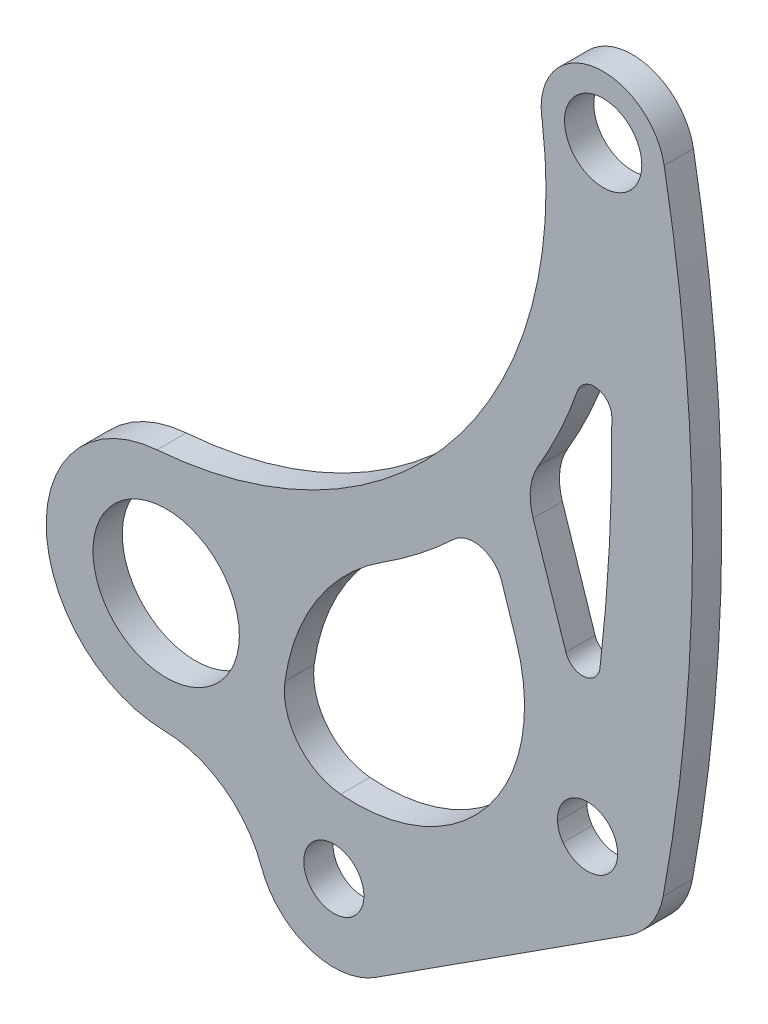
ISO-10303-21;
HEADER;
FILE_DESCRIPTION(('STEP AP214'),'2;1');
FILE_NAME('part.step','',(''),(''),'','','');
FILE_SCHEMA(('AUTOMOTIVE_DESIGN { 1 0 10303 214 1 1 1 1 }'));
ENDSEC;
DATA;
#1=APPLICATION_CONTEXT('core data for automotive mechanical design processes');
#2=APPLICATION_PROTOCOL_DEFINITION('international standard','automotive_design',2000,#1);
#3=PRODUCT_CONTEXT('',#1,'mechanical');
#4=PRODUCT('Part','Part','',(#3));
#5=PRODUCT_RELATED_PRODUCT_CATEGORY('part','',(#4));
#6=PRODUCT_DEFINITION_FORMATION('','',#4);
#7=PRODUCT_DEFINITION_CONTEXT('part definition',#1,'design');
#8=PRODUCT_DEFINITION('design','',#6,#7);
#9=PRODUCT_DEFINITION_SHAPE('','',#8);
#10=(LENGTH_UNIT() NAMED_UNIT(*) SI_UNIT(.MILLI.,.METRE.));
#11=(NAMED_UNIT(*) PLANE_ANGLE_UNIT() SI_UNIT($,.RADIAN.));
#12=(NAMED_UNIT(*) SI_UNIT($,.STERADIAN.) SOLID_ANGLE_UNIT());
#13=UNCERTAINTY_MEASURE_WITH_UNIT(LENGTH_MEASURE(1.E-05),#10,'distance_accuracy_value','');
#14=(GEOMETRIC_REPRESENTATION_CONTEXT(3) GLOBAL_UNCERTAINTY_ASSIGNED_CONTEXT((#13)) GLOBAL_UNIT_ASSIGNED_CONTEXT((#10,
#11,#12)) REPRESENTATION_CONTEXT('',''));
#15=CARTESIAN_POINT('',(0.,0.,0.));
#16=DIRECTION('',(0.,0.,1.));
#17=DIRECTION('',(1.,0.,0.));
#18=AXIS2_PLACEMENT_3D('',#15,#16,#17);
#19=CARTESIAN_POINT('',(0.,0.,3.175));
#20=DIRECTION('',(0.,0.,1.));
#21=DIRECTION('',(1.,0.,0.));
#22=AXIS2_PLACEMENT_3D('',#19,#20,#21);
#23=PLANE('',#22);
#24=CARTESIAN_POINT('',(18.1918286643398,-17.726177530627,3.175));
#25=DIRECTION('',(0.,0.,1.));
#26=DIRECTION('',(1.,0.,0.));
#27=AXIS2_PLACEMENT_3D('',#24,#25,#26);
#28=CIRCLE('',#27,3.2639);
#29=CARTESIAN_POINT('',(21.4557286643398,-17.726177530627,3.175));
#30=VERTEX_POINT('',#29);
#31=EDGE_CURVE('E348',#30,#30,#28,.T.);
#32=ORIENTED_EDGE('',*,*,#31,.F.);
#33=EDGE_LOOP('',(#32));
#34=FACE_BOUND('',#33,.T.);
#35=CARTESIAN_POINT('',(45.72,0.,3.175));
#36=DIRECTION('',(0.,0.,1.));
#37=DIRECTION('',(1.,0.,0.));
#38=AXIS2_PLACEMENT_3D('',#35,#36,#37);
#39=CIRCLE('',#38,3.2639);
#40=CARTESIAN_POINT('',(43.0519360241002,-1.88002069948861,3.175));
#41=VERTEX_POINT('',#40);
#42=CARTESIAN_POINT('',(48.9774236201806,0.205510507492002,3.175));
#43=VERTEX_POINT('',#42);
#44=EDGE_CURVE('E344',#41,#43,#39,.T.);
#45=ORIENTED_EDGE('',*,*,#44,.F.);
#46=CARTESIAN_POINT('',(42.4625763798194,-0.205510507492002,3.175));
#47=VERTEX_POINT('',#46);
#48=EDGE_CURVE('E343',#47,#41,#39,.T.);
#49=ORIENTED_EDGE('',*,*,#48,.F.);
#50=CARTESIAN_POINT('',(48.3880639758998,1.88002069948861,3.175));
#51=VERTEX_POINT('',#50);
#52=EDGE_CURVE('E350',#51,#47,#39,.T.);
#53=ORIENTED_EDGE('',*,*,#52,.F.);
#54=EDGE_CURVE('E349',#43,#51,#39,.T.);
#55=ORIENTED_EDGE('',*,*,#54,.F.);
#56=EDGE_LOOP('',(#45,#49,#53,#55));
#57=FACE_BOUND('',#56,.T.);
#58=DIRECTION('',(0.312500715155273,-0.949917524329056,0.));
#59=VECTOR('',#58,1.);
#60=CARTESIAN_POINT('',(43.9242602583384,14.4500573911322,3.175));
#61=LINE('',#60,#59);
#62=CARTESIAN_POINT('',(39.8116959434713,26.9511389028385,3.175));
#63=VERTEX_POINT('',#62);
#64=CARTESIAN_POINT('',(43.3685228303553,16.1393486348481,3.175));
#65=VERTEX_POINT('',#64);
#66=EDGE_CURVE('E340',#63,#65,#61,.T.);
#67=ORIENTED_EDGE('',*,*,#66,.F.);
#68=CARTESIAN_POINT('',(45.8436722229608,28.9355184440745,3.175));
#69=DIRECTION('',(0.,0.,1.));
#70=DIRECTION('',(1.,0.,0.));
#71=AXIS2_PLACEMENT_3D('',#68,#69,#70);
#72=CIRCLE('',#71,6.35);
#73=CARTESIAN_POINT('',(40.3709543283503,32.1560554871792,3.175));
#74=VERTEX_POINT('',#73);
#75=EDGE_CURVE('E482',#63,#74,#72,.F.);
#76=ORIENTED_EDGE('',*,*,#75,.T.);
#77=CARTESIAN_POINT('',(-4.50533240745612,58.5644592406378,3.175));
#78=DIRECTION('',(0.,0.,1.));
#79=DIRECTION('',(1.,0.,0.));
#80=AXIS2_PLACEMENT_3D('',#77,#78,#79);
#81=CIRCLE('',#80,52.07);
#82=CARTESIAN_POINT('',(44.646607754843,41.3780786361658,3.175));
#83=VERTEX_POINT('',#82);
#84=EDGE_CURVE('E329',#74,#83,#81,.T.);
#85=ORIENTED_EDGE('',*,*,#84,.T.);
#86=CARTESIAN_POINT('',(46.4448494680978,40.7493086140509,3.175));
#87=DIRECTION('',(0.,0.,1.));
#88=DIRECTION('',(1.,0.,0.));
#89=AXIS2_PLACEMENT_3D('',#86,#87,#88);
#90=CIRCLE('',#89,1.905);
#91=CARTESIAN_POINT('',(48.3497321227549,40.7704526909221,3.175));
#92=VERTEX_POINT('',#91);
#93=EDGE_CURVE('E469',#83,#92,#90,.F.);
#94=ORIENTED_EDGE('',*,*,#93,.T.);
#95=CARTESIAN_POINT('',(-142.138533342949,38.656045003802,3.175));
#96=DIRECTION('',(0.,0.,1.));
#97=DIRECTION('',(1.,0.,0.));
#98=AXIS2_PLACEMENT_3D('',#95,#96,#97);
#99=CIRCLE('',#98,190.5);
#100=CARTESIAN_POINT('',(47.0702030784157,16.5132343910918,3.175));
#101=VERTEX_POINT('',#100);
#102=EDGE_CURVE('E336',#101,#92,#99,.T.);
#103=ORIENTED_EDGE('',*,*,#102,.F.);
#104=CARTESIAN_POINT('',(45.1781157142021,16.7346624972189,3.175));
#105=DIRECTION('',(0.,0.,1.));
#106=DIRECTION('',(1.,0.,0.));
#107=AXIS2_PLACEMENT_3D('',#104,#105,#106);
#108=CIRCLE('',#107,1.905);
#109=EDGE_CURVE('E461',#101,#65,#108,.F.);
#110=ORIENTED_EDGE('',*,*,#109,.T.);
#111=EDGE_LOOP('',(#67,#76,#85,#94,#103,#110));
#112=FACE_BOUND('',#111,.T.);
#113=CARTESIAN_POINT('',(0.,0.,3.175));
#114=DIRECTION('',(0.,0.,1.));
#115=DIRECTION('',(1.,0.,0.));
#116=AXIS2_PLACEMENT_3D('',#113,#114,#115);
#117=CIRCLE('',#116,7.9375);
#118=CARTESIAN_POINT('',(7.9375,0.,3.175));
#119=VERTEX_POINT('',#118);
#120=EDGE_CURVE('E332',#119,#119,#117,.T.);
#121=ORIENTED_EDGE('',*,*,#120,.F.);
#122=EDGE_LOOP('',(#121));
#123=FACE_BOUND('',#122,.T.);
#124=CARTESIAN_POINT('',(47.4133333333333,66.0182870288394,3.175));
#125=DIRECTION('',(0.,0.,1.));
#126=DIRECTION('',(1.,0.,0.));
#127=AXIS2_PLACEMENT_3D('',#124,#125,#126);
#128=CIRCLE('',#127,4.1910000000001);
#129=CARTESIAN_POINT('',(51.6043333333335,66.0182870288394,3.175));
#130=VERTEX_POINT('',#129);
#131=EDGE_CURVE('E321',#130,#130,#128,.T.);
#132=ORIENTED_EDGE('',*,*,#131,.F.);
#133=EDGE_LOOP('',(#132));
#134=FACE_BOUND('',#133,.T.);
#135=CARTESIAN_POINT('',(20.5526651985329,8.84578250101602,3.175));
#136=DIRECTION('',(0.,0.,1.));
#137=DIRECTION('',(1.,0.,0.));
#138=AXIS2_PLACEMENT_3D('',#135,#136,#137);
#139=CIRCLE('',#138,18.3327303918695);
#140=CARTESIAN_POINT('',(18.9302496593564,-9.41501626133866,3.175));
#141=VERTEX_POINT('',#140);
#142=CARTESIAN_POINT('',(37.9672470665697,14.574773859224,3.175));
#143=VERTEX_POINT('',#142);
#144=EDGE_CURVE('E279',#141,#143,#139,.T.);
#145=ORIENTED_EDGE('',*,*,#144,.F.);
#146=CARTESIAN_POINT('',(19.5229530139756,-2.7439530083529,3.175));
#147=DIRECTION('',(0.,0.,1.));
#148=DIRECTION('',(1.,0.,0.));
#149=AXIS2_PLACEMENT_3D('',#146,#147,#148);
#150=CIRCLE('',#149,6.69734142715703);
#151=CARTESIAN_POINT('',(12.8907981227458,-1.81180297179721,3.175));
#152=VERTEX_POINT('',#151);
#153=EDGE_CURVE('E268',#152,#141,#150,.T.);
#154=ORIENTED_EDGE('',*,*,#153,.F.);
#155=CARTESIAN_POINT('',(36.0489294684895,-5.06668066004937,3.175));
#156=DIRECTION('',(0.,0.,1.));
#157=DIRECTION('',(1.,0.,0.));
#158=AXIS2_PLACEMENT_3D('',#155,#156,#157);
#159=CIRCLE('',#158,23.3857494254984);
#160=CARTESIAN_POINT('',(23.480081983868,14.6543068684828,3.175));
#161=VERTEX_POINT('',#160);
#162=EDGE_CURVE('E259',#161,#152,#159,.T.);
#163=ORIENTED_EDGE('',*,*,#162,.F.);
#164=CARTESIAN_POINT('',(31.2033161381692,20.667529034551,3.175));
#165=VERTEX_POINT('',#164);
#166=EDGE_CURVE('E325',#161,#165,#81,.T.);
#167=ORIENTED_EDGE('',*,*,#166,.T.);
#168=CARTESIAN_POINT('',(33.3806727568049,18.3567406073506,3.175));
#169=DIRECTION('',(0.,0.,1.));
#170=DIRECTION('',(1.,0.,0.));
#171=AXIS2_PLACEMENT_3D('',#168,#169,#170);
#172=CIRCLE('',#171,3.175);
#173=CARTESIAN_POINT('',(36.3966608965496,19.3489303779686,3.175));
#174=VERTEX_POINT('',#173);
#175=EDGE_CURVE('E11',#165,#174,#172,.F.);
#176=ORIENTED_EDGE('',*,*,#175,.T.);
#177=DIRECTION('',(0.312500715155272,-0.949917524329057,0.));
#178=VECTOR('',#177,1.);
#179=CARTESIAN_POINT('',(38.586011370491,12.6938979852854,3.175));
#180=LINE('',#179,#178);
#181=EDGE_CURVE('E328',#174,#143,#180,.T.);
#182=ORIENTED_EDGE('',*,*,#181,.T.);
#183=EDGE_LOOP('',(#145,#154,#163,#167,#176,#182));
#184=FACE_BOUND('',#183,.T.);
#185=CARTESIAN_POINT('',(-0.369069773877422,-24.3925640918348,3.175));
#186=DIRECTION('',(0.,0.,1.));
#187=DIRECTION('',(1.,0.,0.));
#188=AXIS2_PLACEMENT_3D('',#185,#186,#187);
#189=CIRCLE('',#188,11.3778560226585);
#190=CARTESIAN_POINT('',(10.3390654367292,-20.5465989355037,3.175));
#191=VERTEX_POINT('',#190);
#192=CARTESIAN_POINT('',(-0.196937719498213,-13.0160102099161,3.175));
#193=VERTEX_POINT('',#192);
#194=EDGE_CURVE('E240',#191,#193,#189,.T.);
#195=ORIENTED_EDGE('',*,*,#194,.F.);
#196=CARTESIAN_POINT('',(18.1918286643398,-17.726177530627,3.175));
#197=DIRECTION('',(0.,0.,1.));
#198=DIRECTION('',(1.,0.,0.));
#199=AXIS2_PLACEMENT_3D('',#196,#197,#198);
#200=CIRCLE('',#199,8.3439);
#201=CARTESIAN_POINT('',(22.7091733526832,-24.7414654204214,3.175));
#202=VERTEX_POINT('',#201);
#203=EDGE_CURVE('E311',#191,#202,#200,.T.);
#204=ORIENTED_EDGE('',*,*,#203,.T.);
#205=DIRECTION('',(-0.840768452377708,-0.541394873901105,0.));
#206=VECTOR('',#205,1.);
#207=CARTESIAN_POINT('',(17.9182611700613,-27.8264709170555,3.175));
#208=LINE('',#207,#206);
#209=CARTESIAN_POINT('',(50.2373446883434,-7.01528788979437,3.175));
#210=VERTEX_POINT('',#209);
#211=EDGE_CURVE('E314',#210,#202,#208,.T.);
#212=ORIENTED_EDGE('',*,*,#211,.F.);
#213=CARTESIAN_POINT('',(45.72,0.,3.175));
#214=DIRECTION('',(0.,0.,1.));
#215=DIRECTION('',(1.,0.,0.));
#216=AXIS2_PLACEMENT_3D('',#213,#214,#215);
#217=CIRCLE('',#216,8.3439);
#218=CARTESIAN_POINT('',(53.9245222927567,-1.51871036002841,3.175));
#219=VERTEX_POINT('',#218);
#220=EDGE_CURVE('E318',#210,#219,#217,.T.);
#221=ORIENTED_EDGE('',*,*,#220,.T.);
#222=CARTESIAN_POINT('',(-133.393338272466,33.1550421520357,3.175));
#223=DIRECTION('',(0.,0.,1.));
#224=DIRECTION('',(1.,0.,0.));
#225=AXIS2_PLACEMENT_3D('',#222,#223,#224);
#226=CIRCLE('',#225,190.5);
#227=CARTESIAN_POINT('',(54.0358306347205,67.2219857008992,3.175));
#228=VERTEX_POINT('',#227);
#229=EDGE_CURVE('E292',#219,#228,#226,.T.);
#230=ORIENTED_EDGE('',*,*,#229,.T.);
#231=CARTESIAN_POINT('',(47.4133333333333,66.0182870288394,3.175));
#232=DIRECTION('',(0.,0.,1.));
#233=DIRECTION('',(1.,0.,0.));
#234=AXIS2_PLACEMENT_3D('',#231,#232,#233);
#235=CIRCLE('',#234,6.73099999999993);
#236=CARTESIAN_POINT('',(40.8591949138478,64.4854365539976,3.175));
#237=VERTEX_POINT('',#236);
#238=EDGE_CURVE('E296',#228,#237,#235,.T.);
#239=ORIENTED_EDGE('',*,*,#238,.T.);
#240=DIRECTION('',(0.620152177463137,0.784481533745524,0.));
#241=VECTOR('',#240,1.);
#242=CARTESIAN_POINT('',(-6.2268221741051,4.92245790861365,3.175));
#243=LINE('',#242,#241);
#244=CARTESIAN_POINT('',(40.8338272840695,64.4533469510919,3.175));
#245=VERTEX_POINT('',#244);
#246=EDGE_CURVE('E300',#245,#237,#243,.T.);
#247=ORIENTED_EDGE('',*,*,#246,.F.);
#248=CARTESIAN_POINT('',(-4.50533240745612,58.5644592406378,3.175));
#249=DIRECTION('',(0.,0.,1.));
#250=DIRECTION('',(1.,0.,0.));
#251=AXIS2_PLACEMENT_3D('',#248,#249,#250);
#252=CIRCLE('',#251,45.72);
#253=CARTESIAN_POINT('',(-0.99847907408487,12.9791504263035,3.175));
#254=VERTEX_POINT('',#253);
#255=EDGE_CURVE('E304',#254,#245,#252,.T.);
#256=ORIENTED_EDGE('',*,*,#255,.F.);
#257=CARTESIAN_POINT('',(0.,0.,3.175));
#258=DIRECTION('',(0.,0.,1.));
#259=DIRECTION('',(1.,0.,0.));
#260=AXIS2_PLACEMENT_3D('',#257,#258,#259);
#261=CIRCLE('',#260,13.0175);
#262=EDGE_CURVE('E308',#254,#193,#261,.T.);
#263=ORIENTED_EDGE('',*,*,#262,.T.);
#264=EDGE_LOOP('',(#195,#204,#212,#221,#230,#239,#247,#256,#263));
#265=FACE_BOUND('',#264,.T.);
#266=ADVANCED_FACE('F51',(#34,#57,#112,#123,#134,#184,#265),#23,.T.);
#267=CARTESIAN_POINT('',(0.,0.,0.));
#268=DIRECTION('',(0.,0.,1.));
#269=DIRECTION('',(1.,0.,0.));
#270=AXIS2_PLACEMENT_3D('',#267,#268,#269);
#271=PLANE('',#270);
#272=CARTESIAN_POINT('',(19.5229530139756,-2.7439530083529,0.));
#273=DIRECTION('',(0.,0.,1.));
#274=DIRECTION('',(1.,0.,0.));
#275=AXIS2_PLACEMENT_3D('',#272,#273,#274);
#276=CIRCLE('',#275,6.69734142715703);
#277=CARTESIAN_POINT('',(12.8907981227458,-1.81180297179721,0.));
#278=VERTEX_POINT('',#277);
#279=CARTESIAN_POINT('',(18.9302496593564,-9.41501626133866,0.));
#280=VERTEX_POINT('',#279);
#281=EDGE_CURVE('E269',#278,#280,#276,.T.);
#282=ORIENTED_EDGE('',*,*,#281,.T.);
#283=CARTESIAN_POINT('',(20.5526651985329,8.84578250101602,0.));
#284=DIRECTION('',(0.,0.,1.));
#285=DIRECTION('',(1.,0.,0.));
#286=AXIS2_PLACEMENT_3D('',#283,#284,#285);
#287=CIRCLE('',#286,18.3327303918695);
#288=CARTESIAN_POINT('',(37.9672470665697,14.574773859224,0.));
#289=VERTEX_POINT('',#288);
#290=EDGE_CURVE('E280',#280,#289,#287,.T.);
#291=ORIENTED_EDGE('',*,*,#290,.T.);
#292=DIRECTION('',(0.312500715155272,-0.949917524329057,0.));
#293=VECTOR('',#292,1.);
#294=CARTESIAN_POINT('',(38.586011370491,12.6938979852854,0.));
#295=LINE('',#294,#293);
#296=CARTESIAN_POINT('',(36.3966608965496,19.3489303779686,0.));
#297=VERTEX_POINT('',#296);
#298=EDGE_CURVE('E383',#297,#289,#295,.T.);
#299=ORIENTED_EDGE('',*,*,#298,.F.);
#300=CARTESIAN_POINT('',(33.3806727568049,18.3567406073506,0.));
#301=DIRECTION('',(0.,0.,1.));
#302=DIRECTION('',(1.,0.,0.));
#303=AXIS2_PLACEMENT_3D('',#300,#301,#302);
#304=CIRCLE('',#303,3.175);
#305=CARTESIAN_POINT('',(31.2033161381692,20.667529034551,0.));
#306=VERTEX_POINT('',#305);
#307=EDGE_CURVE('E60',#297,#306,#304,.T.);
#308=ORIENTED_EDGE('',*,*,#307,.T.);
#309=CARTESIAN_POINT('',(-4.50533240745612,58.5644592406378,0.));
#310=DIRECTION('',(0.,0.,1.));
#311=DIRECTION('',(1.,0.,0.));
#312=AXIS2_PLACEMENT_3D('',#309,#310,#311);
#313=CIRCLE('',#312,52.07);
#314=CARTESIAN_POINT('',(23.480081983868,14.6543068684828,0.));
#315=VERTEX_POINT('',#314);
#316=EDGE_CURVE('E380',#315,#306,#313,.T.);
#317=ORIENTED_EDGE('',*,*,#316,.F.);
#318=CARTESIAN_POINT('',(36.0489294684895,-5.06668066004937,0.));
#319=DIRECTION('',(0.,0.,1.));
#320=DIRECTION('',(1.,0.,0.));
#321=AXIS2_PLACEMENT_3D('',#318,#319,#320);
#322=CIRCLE('',#321,23.3857494254984);
#323=EDGE_CURVE('E263',#315,#278,#322,.T.);
#324=ORIENTED_EDGE('',*,*,#323,.T.);
#325=EDGE_LOOP('',(#282,#291,#299,#308,#317,#324));
#326=FACE_BOUND('',#325,.T.);
#327=CARTESIAN_POINT('',(47.4133333333333,66.0182870288394,0.));
#328=DIRECTION('',(0.,0.,1.));
#329=DIRECTION('',(1.,0.,0.));
#330=AXIS2_PLACEMENT_3D('',#327,#328,#329);
#331=CIRCLE('',#330,4.1910000000001);
#332=CARTESIAN_POINT('',(51.6043333333335,66.0182870288394,0.));
#333=VERTEX_POINT('',#332);
#334=EDGE_CURVE('E376',#333,#333,#331,.T.);
#335=ORIENTED_EDGE('',*,*,#334,.T.);
#336=EDGE_LOOP('',(#335));
#337=FACE_BOUND('',#336,.T.);
#338=CARTESIAN_POINT('',(0.,0.,0.));
#339=DIRECTION('',(0.,0.,1.));
#340=DIRECTION('',(1.,0.,0.));
#341=AXIS2_PLACEMENT_3D('',#338,#339,#340);
#342=CIRCLE('',#341,7.9375);
#343=CARTESIAN_POINT('',(7.9375,0.,0.));
#344=VERTEX_POINT('',#343);
#345=EDGE_CURVE('E387',#344,#344,#342,.T.);
#346=ORIENTED_EDGE('',*,*,#345,.T.);
#347=EDGE_LOOP('',(#346));
#348=FACE_BOUND('',#347,.T.);
#349=CARTESIAN_POINT('',(40.3709543283503,32.1560554871792,0.));
#350=VERTEX_POINT('',#349);
#351=CARTESIAN_POINT('',(44.646607754843,41.3780786361658,0.));
#352=VERTEX_POINT('',#351);
#353=EDGE_CURVE('E384',#350,#352,#313,.T.);
#354=ORIENTED_EDGE('',*,*,#353,.F.);
#355=CARTESIAN_POINT('',(45.8436722229608,28.9355184440745,0.));
#356=DIRECTION('',(0.,0.,1.));
#357=DIRECTION('',(1.,0.,0.));
#358=AXIS2_PLACEMENT_3D('',#355,#356,#357);
#359=CIRCLE('',#358,6.35);
#360=CARTESIAN_POINT('',(39.8116959434713,26.9511389028385,0.));
#361=VERTEX_POINT('',#360);
#362=EDGE_CURVE('E479',#350,#361,#359,.T.);
#363=ORIENTED_EDGE('',*,*,#362,.T.);
#364=DIRECTION('',(0.312500715155273,-0.949917524329056,0.));
#365=VECTOR('',#364,1.);
#366=CARTESIAN_POINT('',(43.9242602583384,14.4500573911322,0.));
#367=LINE('',#366,#365);
#368=CARTESIAN_POINT('',(43.3685228303553,16.1393486348481,0.));
#369=VERTEX_POINT('',#368);
#370=EDGE_CURVE('E395',#361,#369,#367,.T.);
#371=ORIENTED_EDGE('',*,*,#370,.T.);
#372=CARTESIAN_POINT('',(45.1781157142021,16.7346624972189,0.));
#373=DIRECTION('',(0.,0.,1.));
#374=DIRECTION('',(1.,0.,0.));
#375=AXIS2_PLACEMENT_3D('',#372,#373,#374);
#376=CIRCLE('',#375,1.905);
#377=CARTESIAN_POINT('',(47.0702030784157,16.5132343910918,0.));
#378=VERTEX_POINT('',#377);
#379=EDGE_CURVE('E458',#369,#378,#376,.T.);
#380=ORIENTED_EDGE('',*,*,#379,.T.);
#381=CARTESIAN_POINT('',(-142.138533342949,38.656045003802,0.));
#382=DIRECTION('',(0.,0.,1.));
#383=DIRECTION('',(1.,0.,0.));
#384=AXIS2_PLACEMENT_3D('',#381,#382,#383);
#385=CIRCLE('',#384,190.5);
#386=CARTESIAN_POINT('',(48.3497321227549,40.7704526909221,0.));
#387=VERTEX_POINT('',#386);
#388=EDGE_CURVE('E391',#378,#387,#385,.T.);
#389=ORIENTED_EDGE('',*,*,#388,.T.);
#390=CARTESIAN_POINT('',(46.4448494680978,40.7493086140509,0.));
#391=DIRECTION('',(0.,0.,1.));
#392=DIRECTION('',(1.,0.,0.));
#393=AXIS2_PLACEMENT_3D('',#390,#391,#392);
#394=CIRCLE('',#393,1.905);
#395=EDGE_CURVE('E465',#387,#352,#394,.T.);
#396=ORIENTED_EDGE('',*,*,#395,.T.);
#397=EDGE_LOOP('',(#354,#363,#371,#380,#389,#396));
#398=FACE_BOUND('',#397,.T.);
#399=CARTESIAN_POINT('',(45.72,0.,0.));
#400=DIRECTION('',(0.,0.,1.));
#401=DIRECTION('',(1.,0.,0.));
#402=AXIS2_PLACEMENT_3D('',#399,#400,#401);
#403=CIRCLE('',#402,3.2639);
#404=CARTESIAN_POINT('',(43.0519360241002,-1.88002069948861,0.));
#405=VERTEX_POINT('',#404);
#406=CARTESIAN_POINT('',(48.9774236201806,0.205510507492002,0.));
#407=VERTEX_POINT('',#406);
#408=EDGE_CURVE('E399',#405,#407,#403,.T.);
#409=ORIENTED_EDGE('',*,*,#408,.T.);
#410=CARTESIAN_POINT('',(48.3880639758998,1.88002069948861,0.));
#411=VERTEX_POINT('',#410);
#412=EDGE_CURVE('E403',#407,#411,#403,.T.);
#413=ORIENTED_EDGE('',*,*,#412,.T.);
#414=CARTESIAN_POINT('',(42.4625763798194,-0.205510507492002,0.));
#415=VERTEX_POINT('',#414);
#416=EDGE_CURVE('E404',#411,#415,#403,.T.);
#417=ORIENTED_EDGE('',*,*,#416,.T.);
#418=EDGE_CURVE('E398',#415,#405,#403,.T.);
#419=ORIENTED_EDGE('',*,*,#418,.T.);
#420=EDGE_LOOP('',(#409,#413,#417,#419));
#421=FACE_BOUND('',#420,.T.);
#422=CARTESIAN_POINT('',(18.1918286643398,-17.726177530627,0.));
#423=DIRECTION('',(0.,0.,1.));
#424=DIRECTION('',(1.,0.,0.));
#425=AXIS2_PLACEMENT_3D('',#422,#423,#424);
#426=CIRCLE('',#425,3.2639);
#427=CARTESIAN_POINT('',(21.4557286643398,-17.726177530627,0.));
#428=VERTEX_POINT('',#427);
#429=EDGE_CURVE('E297',#428,#428,#426,.T.);
#430=ORIENTED_EDGE('',*,*,#429,.T.);
#431=EDGE_LOOP('',(#430));
#432=FACE_BOUND('',#431,.T.);
#433=CARTESIAN_POINT('',(18.1918286643398,-17.726177530627,0.));
#434=DIRECTION('',(0.,0.,1.));
#435=DIRECTION('',(1.,0.,0.));
#436=AXIS2_PLACEMENT_3D('',#433,#434,#435);
#437=CIRCLE('',#436,8.3439);
#438=CARTESIAN_POINT('',(10.3390654367292,-20.5465989355037,0.));
#439=VERTEX_POINT('',#438);
#440=CARTESIAN_POINT('',(22.7091733526832,-24.7414654204214,0.));
#441=VERTEX_POINT('',#440);
#442=EDGE_CURVE('E231',#439,#441,#437,.T.);
#443=ORIENTED_EDGE('',*,*,#442,.F.);
#444=CARTESIAN_POINT('',(-0.369069773877422,-24.3925640918348,0.));
#445=DIRECTION('',(0.,0.,1.));
#446=DIRECTION('',(1.,0.,0.));
#447=AXIS2_PLACEMENT_3D('',#444,#445,#446);
#448=CIRCLE('',#447,11.3778560226585);
#449=CARTESIAN_POINT('',(-0.196937719498213,-13.0160102099161,0.));
#450=VERTEX_POINT('',#449);
#451=EDGE_CURVE('E238',#439,#450,#448,.T.);
#452=ORIENTED_EDGE('',*,*,#451,.T.);
#453=CARTESIAN_POINT('',(0.,0.,0.));
#454=DIRECTION('',(0.,0.,1.));
#455=DIRECTION('',(1.,0.,0.));
#456=AXIS2_PLACEMENT_3D('',#453,#454,#455);
#457=CIRCLE('',#456,13.0175);
#458=CARTESIAN_POINT('',(-0.99847907408487,12.9791504263035,0.));
#459=VERTEX_POINT('',#458);
#460=EDGE_CURVE('E219',#459,#450,#457,.T.);
#461=ORIENTED_EDGE('',*,*,#460,.F.);
#462=CARTESIAN_POINT('',(-4.50533240745612,58.5644592406378,0.));
#463=DIRECTION('',(0.,0.,1.));
#464=DIRECTION('',(1.,0.,0.));
#465=AXIS2_PLACEMENT_3D('',#462,#463,#464);
#466=CIRCLE('',#465,45.72);
#467=CARTESIAN_POINT('',(40.8338272840695,64.4533469510919,0.));
#468=VERTEX_POINT('',#467);
#469=EDGE_CURVE('E232',#459,#468,#466,.T.);
#470=ORIENTED_EDGE('',*,*,#469,.T.);
#471=DIRECTION('',(0.620152177463137,0.784481533745524,0.));
#472=VECTOR('',#471,1.);
#473=CARTESIAN_POINT('',(-6.2268221741051,4.92245790861365,0.));
#474=LINE('',#473,#472);
#475=CARTESIAN_POINT('',(40.8591949138478,64.4854365539976,0.));
#476=VERTEX_POINT('',#475);
#477=EDGE_CURVE('E362',#468,#476,#474,.T.);
#478=ORIENTED_EDGE('',*,*,#477,.T.);
#479=CARTESIAN_POINT('',(47.4133333333333,66.0182870288394,0.));
#480=DIRECTION('',(0.,0.,1.));
#481=DIRECTION('',(1.,0.,0.));
#482=AXIS2_PLACEMENT_3D('',#479,#480,#481);
#483=CIRCLE('',#482,6.73099999999993);
#484=CARTESIAN_POINT('',(54.0358306347205,67.2219857008992,0.));
#485=VERTEX_POINT('',#484);
#486=EDGE_CURVE('E358',#485,#476,#483,.T.);
#487=ORIENTED_EDGE('',*,*,#486,.F.);
#488=CARTESIAN_POINT('',(-133.393338272466,33.1550421520357,0.));
#489=DIRECTION('',(0.,0.,1.));
#490=DIRECTION('',(1.,0.,0.));
#491=AXIS2_PLACEMENT_3D('',#488,#489,#490);
#492=CIRCLE('',#491,190.5);
#493=CARTESIAN_POINT('',(53.9245222927567,-1.51871036002841,0.));
#494=VERTEX_POINT('',#493);
#495=EDGE_CURVE('E291',#494,#485,#492,.T.);
#496=ORIENTED_EDGE('',*,*,#495,.F.);
#497=CARTESIAN_POINT('',(45.72,0.,0.));
#498=DIRECTION('',(0.,0.,1.));
#499=DIRECTION('',(1.,0.,0.));
#500=AXIS2_PLACEMENT_3D('',#497,#498,#499);
#501=CIRCLE('',#500,8.3439);
#502=CARTESIAN_POINT('',(50.2373446883434,-7.01528788979437,0.));
#503=VERTEX_POINT('',#502);
#504=EDGE_CURVE('E373',#503,#494,#501,.T.);
#505=ORIENTED_EDGE('',*,*,#504,.F.);
#506=DIRECTION('',(-0.840768452377708,-0.541394873901105,0.));
#507=VECTOR('',#506,1.);
#508=CARTESIAN_POINT('',(17.9182611700613,-27.8264709170555,0.));
#509=LINE('',#508,#507);
#510=EDGE_CURVE('E370',#503,#441,#509,.T.);
#511=ORIENTED_EDGE('',*,*,#510,.T.);
#512=EDGE_LOOP('',(#443,#452,#461,#470,#478,#487,#496,#505,#511));
#513=FACE_BOUND('',#512,.T.);
#514=ADVANCED_FACE('F244',(#326,#337,#348,#398,#421,#432,#513),#271,.F.);
#515=CARTESIAN_POINT('',(-4.50533240745612,58.5644592406378,3.175));
#516=DIRECTION('',(0.,0.,-1.));
#517=DIRECTION('',(-1.,0.,0.));
#518=AXIS2_PLACEMENT_3D('',#515,#516,#517);
#519=CYLINDRICAL_SURFACE('',#518,52.07);
#520=ORIENTED_EDGE('',*,*,#316,.T.);
#521=DIRECTION('',(0.,0.,-1.));
#522=VECTOR('',#521,1.);
#523=CARTESIAN_POINT('',(31.2033161381692,20.667529034551,3.175));
#524=LINE('',#523,#522);
#525=EDGE_CURVE('E67',#306,#165,#524,.F.);
#526=ORIENTED_EDGE('',*,*,#525,.T.);
#527=ORIENTED_EDGE('',*,*,#166,.F.);
#528=DIRECTION('',(0.,0.,1.));
#529=VECTOR('',#528,1.);
#530=CARTESIAN_POINT('',(23.480081983868,14.6543068684828,0.));
#531=LINE('',#530,#529);
#532=EDGE_CURVE('E260',#315,#161,#531,.T.);
#533=ORIENTED_EDGE('',*,*,#532,.F.);
#534=EDGE_LOOP('',(#520,#526,#527,#533));
#535=FACE_BOUND('',#534,.T.);
#536=ADVANCED_FACE('F571',(#535),#519,.T.);
#537=CARTESIAN_POINT('',(45.72,0.,3.175));
#538=DIRECTION('',(0.,0.,-1.));
#539=DIRECTION('',(-1.,0.,0.));
#540=AXIS2_PLACEMENT_3D('',#537,#538,#539);
#541=CYLINDRICAL_SURFACE('',#540,3.2639);
#542=ORIENTED_EDGE('',*,*,#418,.F.);
#543=DIRECTION('',(0.,0.,1.));
#544=VECTOR('',#543,1.);
#545=CARTESIAN_POINT('',(42.4625763798194,-0.205510507492002,3.175));
#546=LINE('',#545,#544);
#547=EDGE_CURVE('E440',#415,#47,#546,.T.);
#548=ORIENTED_EDGE('',*,*,#547,.T.);
#549=ORIENTED_EDGE('',*,*,#48,.T.);
#550=DIRECTION('',(0.,0.,1.));
#551=VECTOR('',#550,1.);
#552=CARTESIAN_POINT('',(43.0519360241002,-1.88002069948861,3.175));
#553=LINE('',#552,#551);
#554=EDGE_CURVE('E429',#405,#41,#553,.T.);
#555=ORIENTED_EDGE('',*,*,#554,.F.);
#556=EDGE_LOOP('',(#542,#548,#549,#555));
#557=FACE_BOUND('',#556,.T.);
#558=ADVANCED_FACE('F561',(#557),#541,.F.);
#559=ORIENTED_EDGE('',*,*,#44,.T.);
#560=DIRECTION('',(0.,0.,-1.));
#561=VECTOR('',#560,1.);
#562=CARTESIAN_POINT('',(48.9774236201806,0.205510507492002,3.175));
#563=LINE('',#562,#561);
#564=EDGE_CURVE('E437',#43,#407,#563,.T.);
#565=ORIENTED_EDGE('',*,*,#564,.T.);
#566=ORIENTED_EDGE('',*,*,#408,.F.);
#567=ORIENTED_EDGE('',*,*,#554,.T.);
#568=EDGE_LOOP('',(#559,#565,#566,#567));
#569=FACE_BOUND('',#568,.T.);
#570=ADVANCED_FACE('F1010',(#569),#541,.F.);
#571=ORIENTED_EDGE('',*,*,#564,.F.);
#572=ORIENTED_EDGE('',*,*,#54,.T.);
#573=DIRECTION('',(0.,0.,-1.));
#574=VECTOR('',#573,1.);
#575=CARTESIAN_POINT('',(48.3880639758998,1.88002069948861,3.175));
#576=LINE('',#575,#574);
#577=EDGE_CURVE('E433',#51,#411,#576,.T.);
#578=ORIENTED_EDGE('',*,*,#577,.T.);
#579=ORIENTED_EDGE('',*,*,#412,.F.);
#580=EDGE_LOOP('',(#571,#572,#578,#579));
#581=FACE_BOUND('',#580,.T.);
#582=ADVANCED_FACE('F562',(#581),#541,.F.);
#583=ORIENTED_EDGE('',*,*,#84,.F.);
#584=DIRECTION('',(0.,0.,-1.));
#585=VECTOR('',#584,1.);
#586=CARTESIAN_POINT('',(40.3709543283503,32.1560554871792,3.175));
#587=LINE('',#586,#585);
#588=EDGE_CURVE('E472',#74,#350,#587,.T.);
#589=ORIENTED_EDGE('',*,*,#588,.T.);
#590=ORIENTED_EDGE('',*,*,#353,.T.);
#591=DIRECTION('',(0.,0.,-1.));
#592=VECTOR('',#591,1.);
#593=CARTESIAN_POINT('',(44.646607754843,41.3780786361658,3.175));
#594=LINE('',#593,#592);
#595=EDGE_CURVE('E454',#352,#83,#594,.F.);
#596=ORIENTED_EDGE('',*,*,#595,.T.);
#597=EDGE_LOOP('',(#583,#589,#590,#596));
#598=FACE_BOUND('',#597,.T.);
#599=ADVANCED_FACE('F516',(#598),#519,.T.);
#600=CARTESIAN_POINT('',(-142.138533342949,38.656045003802,3.175));
#601=DIRECTION('',(0.,0.,-1.));
#602=DIRECTION('',(-1.,0.,0.));
#603=AXIS2_PLACEMENT_3D('',#600,#601,#602);
#604=CYLINDRICAL_SURFACE('',#603,190.5);
#605=ORIENTED_EDGE('',*,*,#388,.F.);
#606=DIRECTION('',(0.,0.,-1.));
#607=VECTOR('',#606,1.);
#608=CARTESIAN_POINT('',(47.0702030784158,16.5132343910918,3.175));
#609=LINE('',#608,#607);
#610=EDGE_CURVE('E451',#378,#101,#609,.F.);
#611=ORIENTED_EDGE('',*,*,#610,.T.);
#612=ORIENTED_EDGE('',*,*,#102,.T.);
#613=DIRECTION('',(0.,0.,-1.));
#614=VECTOR('',#613,1.);
#615=CARTESIAN_POINT('',(48.3497321227549,40.7704526909221,3.175));
#616=LINE('',#615,#614);
#617=EDGE_CURVE('E447',#92,#387,#616,.T.);
#618=ORIENTED_EDGE('',*,*,#617,.T.);
#619=EDGE_LOOP('',(#605,#611,#612,#618));
#620=FACE_BOUND('',#619,.T.);
#621=ADVANCED_FACE('F532',(#620),#604,.F.);
#622=CARTESIAN_POINT('',(38.586011370491,12.6938979852854,3.175));
#623=DIRECTION('',(0.949917524329056,0.312500715155272,0.));
#624=DIRECTION('',(-0.312500715155272,0.949917524329057,0.));
#625=AXIS2_PLACEMENT_3D('',#622,#623,#624);
#626=PLANE('',#625);
#627=ORIENTED_EDGE('',*,*,#181,.F.);
#628=DIRECTION('',(0.,0.,1.));
#629=VECTOR('',#628,1.);
#630=CARTESIAN_POINT('',(36.3966608965496,19.3489303779686,0.));
#631=LINE('',#630,#629);
#632=EDGE_CURVE('E485',#174,#297,#631,.F.);
#633=ORIENTED_EDGE('',*,*,#632,.T.);
#634=ORIENTED_EDGE('',*,*,#298,.T.);
#635=DIRECTION('',(0.,0.,1.));
#636=VECTOR('',#635,1.);
#637=CARTESIAN_POINT('',(37.9672470665697,14.574773859224,0.));
#638=LINE('',#637,#636);
#639=EDGE_CURVE('E284',#289,#143,#638,.T.);
#640=ORIENTED_EDGE('',*,*,#639,.T.);
#641=EDGE_LOOP('',(#627,#633,#634,#640));
#642=FACE_BOUND('',#641,.T.);
#643=ADVANCED_FACE('F624',(#642),#626,.F.);
#644=CARTESIAN_POINT('',(-133.393338272466,33.1550421520357,3.175));
#645=DIRECTION('',(0.,0.,-1.));
#646=DIRECTION('',(-1.,0.,0.));
#647=AXIS2_PLACEMENT_3D('',#644,#645,#646);
#648=CYLINDRICAL_SURFACE('',#647,190.5);
#649=ORIENTED_EDGE('',*,*,#495,.T.);
#650=DIRECTION('',(0.,0.,-1.));
#651=VECTOR('',#650,1.);
#652=CARTESIAN_POINT('',(54.0358306347205,67.2219857008992,3.175));
#653=LINE('',#652,#651);
#654=EDGE_CURVE('E425',#228,#485,#653,.T.);
#655=ORIENTED_EDGE('',*,*,#654,.F.);
#656=ORIENTED_EDGE('',*,*,#229,.F.);
#657=DIRECTION('',(0.,0.,-1.));
#658=VECTOR('',#657,1.);
#659=CARTESIAN_POINT('',(53.9245222927567,-1.51871036002841,3.175));
#660=LINE('',#659,#658);
#661=EDGE_CURVE('E354',#219,#494,#660,.T.);
#662=ORIENTED_EDGE('',*,*,#661,.T.);
#663=EDGE_LOOP('',(#649,#655,#656,#662));
#664=FACE_BOUND('',#663,.T.);
#665=ADVANCED_FACE('F621',(#664),#648,.T.);
#666=CARTESIAN_POINT('',(47.4133333333333,66.0182870288394,3.175));
#667=DIRECTION('',(0.,0.,-1.));
#668=DIRECTION('',(-1.,0.,0.));
#669=AXIS2_PLACEMENT_3D('',#666,#667,#668);
#670=CYLINDRICAL_SURFACE('',#669,6.73099999999993);
#671=ORIENTED_EDGE('',*,*,#486,.T.);
#672=DIRECTION('',(0.,0.,-1.));
#673=VECTOR('',#672,1.);
#674=CARTESIAN_POINT('',(40.8591949138478,64.4854365539976,3.175));
#675=LINE('',#674,#673);
#676=EDGE_CURVE('E422',#237,#476,#675,.T.);
#677=ORIENTED_EDGE('',*,*,#676,.F.);
#678=ORIENTED_EDGE('',*,*,#238,.F.);
#679=ORIENTED_EDGE('',*,*,#654,.T.);
#680=EDGE_LOOP('',(#671,#677,#678,#679));
#681=FACE_BOUND('',#680,.T.);
#682=ADVANCED_FACE('F617',(#681),#670,.T.);
#683=CARTESIAN_POINT('',(-6.2268221741051,4.92245790861365,3.175));
#684=DIRECTION('',(-0.784481533745524,0.620152177463137,0.));
#685=DIRECTION('',(-0.620152177463137,-0.784481533745524,0.));
#686=AXIS2_PLACEMENT_3D('',#683,#684,#685);
#687=PLANE('',#686);
#688=ORIENTED_EDGE('',*,*,#477,.F.);
#689=DIRECTION('',(0.,0.,-1.));
#690=VECTOR('',#689,1.);
#691=CARTESIAN_POINT('',(40.8338272840695,64.4533469510919,3.175));
#692=LINE('',#691,#690);
#693=EDGE_CURVE('E419',#245,#468,#692,.T.);
#694=ORIENTED_EDGE('',*,*,#693,.F.);
#695=ORIENTED_EDGE('',*,*,#246,.T.);
#696=ORIENTED_EDGE('',*,*,#676,.T.);
#697=EDGE_LOOP('',(#688,#694,#695,#696));
#698=FACE_BOUND('',#697,.T.);
#699=ADVANCED_FACE('F613',(#698),#687,.T.);
#700=CARTESIAN_POINT('',(-4.50533240745612,58.5644592406378,3.175));
#701=DIRECTION('',(0.,0.,-1.));
#702=DIRECTION('',(-1.,0.,0.));
#703=AXIS2_PLACEMENT_3D('',#700,#701,#702);
#704=CYLINDRICAL_SURFACE('',#703,45.72);
#705=ORIENTED_EDGE('',*,*,#469,.F.);
#706=DIRECTION('',(0.,0.,-1.));
#707=VECTOR('',#706,1.);
#708=CARTESIAN_POINT('',(-0.99847907408487,12.9791504263035,3.175));
#709=LINE('',#708,#707);
#710=EDGE_CURVE('E225',#254,#459,#709,.T.);
#711=ORIENTED_EDGE('',*,*,#710,.F.);
#712=ORIENTED_EDGE('',*,*,#255,.T.);
#713=ORIENTED_EDGE('',*,*,#693,.T.);
#714=EDGE_LOOP('',(#705,#711,#712,#713));
#715=FACE_BOUND('',#714,.T.);
#716=ADVANCED_FACE('F610',(#715),#704,.F.);
#717=CARTESIAN_POINT('',(0.,0.,3.175));
#718=DIRECTION('',(0.,0.,-1.));
#719=DIRECTION('',(-1.,0.,0.));
#720=AXIS2_PLACEMENT_3D('',#717,#718,#719);
#721=CYLINDRICAL_SURFACE('',#720,13.0175);
#722=ORIENTED_EDGE('',*,*,#460,.T.);
#723=DIRECTION('',(0.,0.,1.));
#724=VECTOR('',#723,1.);
#725=CARTESIAN_POINT('',(-0.196937719498213,-13.0160102099161,0.));
#726=LINE('',#725,#724);
#727=EDGE_CURVE('E223',#450,#193,#726,.T.);
#728=ORIENTED_EDGE('',*,*,#727,.T.);
#729=ORIENTED_EDGE('',*,*,#262,.F.);
#730=ORIENTED_EDGE('',*,*,#710,.T.);
#731=EDGE_LOOP('',(#722,#728,#729,#730));
#732=FACE_BOUND('',#731,.T.);
#733=ADVANCED_FACE('F221',(#732),#721,.T.);
#734=CARTESIAN_POINT('',(18.1918286643398,-17.726177530627,3.175));
#735=DIRECTION('',(0.,0.,-1.));
#736=DIRECTION('',(-1.,0.,0.));
#737=AXIS2_PLACEMENT_3D('',#734,#735,#736);
#738=CYLINDRICAL_SURFACE('',#737,8.3439);
#739=ORIENTED_EDGE('',*,*,#442,.T.);
#740=DIRECTION('',(0.,0.,-1.));
#741=VECTOR('',#740,1.);
#742=CARTESIAN_POINT('',(22.7091733526832,-24.7414654204214,3.175));
#743=LINE('',#742,#741);
#744=EDGE_CURVE('E414',#202,#441,#743,.T.);
#745=ORIENTED_EDGE('',*,*,#744,.F.);
#746=ORIENTED_EDGE('',*,*,#203,.F.);
#747=DIRECTION('',(0.,0.,1.));
#748=VECTOR('',#747,1.);
#749=CARTESIAN_POINT('',(10.3390654367292,-20.5465989355037,0.));
#750=LINE('',#749,#748);
#751=EDGE_CURVE('E242',#439,#191,#750,.T.);
#752=ORIENTED_EDGE('',*,*,#751,.F.);
#753=EDGE_LOOP('',(#739,#745,#746,#752));
#754=FACE_BOUND('',#753,.T.);
#755=ADVANCED_FACE('F603',(#754),#738,.T.);
#756=CARTESIAN_POINT('',(17.9182611700613,-27.8264709170555,3.175));
#757=DIRECTION('',(0.541394873901105,-0.840768452377708,0.));
#758=DIRECTION('',(0.840768452377708,0.541394873901105,0.));
#759=AXIS2_PLACEMENT_3D('',#756,#757,#758);
#760=PLANE('',#759);
#761=ORIENTED_EDGE('',*,*,#510,.F.);
#762=DIRECTION('',(0.,0.,-1.));
#763=VECTOR('',#762,1.);
#764=CARTESIAN_POINT('',(50.2373446883434,-7.01528788979437,3.175));
#765=LINE('',#764,#763);
#766=EDGE_CURVE('E411',#210,#503,#765,.T.);
#767=ORIENTED_EDGE('',*,*,#766,.F.);
#768=ORIENTED_EDGE('',*,*,#211,.T.);
#769=ORIENTED_EDGE('',*,*,#744,.T.);
#770=EDGE_LOOP('',(#761,#767,#768,#769));
#771=FACE_BOUND('',#770,.T.);
#772=ADVANCED_FACE('F558',(#771),#760,.T.);
#773=ORIENTED_EDGE('',*,*,#547,.F.);
#774=ORIENTED_EDGE('',*,*,#416,.F.);
#775=ORIENTED_EDGE('',*,*,#577,.F.);
#776=ORIENTED_EDGE('',*,*,#52,.T.);
#777=EDGE_LOOP('',(#773,#774,#775,#776));
#778=FACE_BOUND('',#777,.T.);
#779=ADVANCED_FACE('F547',(#778),#541,.F.);
#780=CARTESIAN_POINT('',(43.9242602583384,14.4500573911322,3.175));
#781=DIRECTION('',(0.949917524329056,0.312500715155273,0.));
#782=DIRECTION('',(-0.312500715155273,0.949917524329056,0.));
#783=AXIS2_PLACEMENT_3D('',#780,#781,#782);
#784=PLANE('',#783);
#785=ORIENTED_EDGE('',*,*,#370,.F.);
#786=DIRECTION('',(0.,0.,-1.));
#787=VECTOR('',#786,1.);
#788=CARTESIAN_POINT('',(39.8116959434713,26.9511389028385,3.175));
#789=LINE('',#788,#787);
#790=EDGE_CURVE('E476',#361,#63,#789,.F.);
#791=ORIENTED_EDGE('',*,*,#790,.T.);
#792=ORIENTED_EDGE('',*,*,#66,.T.);
#793=DIRECTION('',(0.,0.,1.));
#794=VECTOR('',#793,1.);
#795=CARTESIAN_POINT('',(43.3685228303553,16.1393486348481,0.));
#796=LINE('',#795,#794);
#797=EDGE_CURVE('E443',#65,#369,#796,.F.);
#798=ORIENTED_EDGE('',*,*,#797,.T.);
#799=EDGE_LOOP('',(#785,#791,#792,#798));
#800=FACE_BOUND('',#799,.T.);
#801=ADVANCED_FACE('F544',(#800),#784,.T.);
#802=CARTESIAN_POINT('',(0.,0.,3.175));
#803=DIRECTION('',(0.,0.,-1.));
#804=DIRECTION('',(-1.,0.,0.));
#805=AXIS2_PLACEMENT_3D('',#802,#803,#804);
#806=CYLINDRICAL_SURFACE('',#805,7.9375);
#807=ORIENTED_EDGE('',*,*,#120,.T.);
#808=EDGE_LOOP('',(#807));
#809=FACE_BOUND('',#808,.T.);
#810=ORIENTED_EDGE('',*,*,#345,.F.);
#811=EDGE_LOOP('',(#810));
#812=FACE_BOUND('',#811,.T.);
#813=ADVANCED_FACE('F546',(#809,#812),#806,.F.);
#814=CARTESIAN_POINT('',(47.4133333333333,66.0182870288394,3.175));
#815=DIRECTION('',(0.,0.,-1.));
#816=DIRECTION('',(-1.,0.,0.));
#817=AXIS2_PLACEMENT_3D('',#814,#815,#816);
#818=CYLINDRICAL_SURFACE('',#817,4.1910000000001);
#819=ORIENTED_EDGE('',*,*,#131,.T.);
#820=EDGE_LOOP('',(#819));
#821=FACE_BOUND('',#820,.T.);
#822=ORIENTED_EDGE('',*,*,#334,.F.);
#823=EDGE_LOOP('',(#822));
#824=FACE_BOUND('',#823,.T.);
#825=ADVANCED_FACE('F554',(#821,#824),#818,.F.);
#826=CARTESIAN_POINT('',(45.72,0.,3.175));
#827=DIRECTION('',(0.,0.,-1.));
#828=DIRECTION('',(-1.,0.,0.));
#829=AXIS2_PLACEMENT_3D('',#826,#827,#828);
#830=CYLINDRICAL_SURFACE('',#829,8.3439);
#831=ORIENTED_EDGE('',*,*,#504,.T.);
#832=ORIENTED_EDGE('',*,*,#661,.F.);
#833=ORIENTED_EDGE('',*,*,#220,.F.);
#834=ORIENTED_EDGE('',*,*,#766,.T.);
#835=EDGE_LOOP('',(#831,#832,#833,#834));
#836=FACE_BOUND('',#835,.T.);
#837=ADVANCED_FACE('F581',(#836),#830,.T.);
#838=CARTESIAN_POINT('',(18.1918286643398,-17.726177530627,3.175));
#839=DIRECTION('',(0.,0.,-1.));
#840=DIRECTION('',(-1.,0.,0.));
#841=AXIS2_PLACEMENT_3D('',#838,#839,#840);
#842=CYLINDRICAL_SURFACE('',#841,3.2639);
#843=ORIENTED_EDGE('',*,*,#31,.T.);
#844=EDGE_LOOP('',(#843));
#845=FACE_BOUND('',#844,.T.);
#846=ORIENTED_EDGE('',*,*,#429,.F.);
#847=EDGE_LOOP('',(#846));
#848=FACE_BOUND('',#847,.T.);
#849=ADVANCED_FACE('F579',(#845,#848),#842,.F.);
#850=CARTESIAN_POINT('',(45.1781157142021,16.7346624972189,3.175));
#851=DIRECTION('',(0.,0.,-1.));
#852=DIRECTION('',(-1.,0.,0.));
#853=AXIS2_PLACEMENT_3D('',#850,#851,#852);
#854=CYLINDRICAL_SURFACE('',#853,1.905);
#855=ORIENTED_EDGE('',*,*,#109,.F.);
#856=ORIENTED_EDGE('',*,*,#610,.F.);
#857=ORIENTED_EDGE('',*,*,#379,.F.);
#858=ORIENTED_EDGE('',*,*,#797,.F.);
#859=EDGE_LOOP('',(#855,#856,#857,#858));
#860=FACE_BOUND('',#859,.T.);
#861=ADVANCED_FACE('F536',(#860),#854,.F.);
#862=CARTESIAN_POINT('',(46.4448494680978,40.7493086140509,3.175));
#863=DIRECTION('',(0.,0.,-1.));
#864=DIRECTION('',(-1.,0.,0.));
#865=AXIS2_PLACEMENT_3D('',#862,#863,#864);
#866=CYLINDRICAL_SURFACE('',#865,1.905);
#867=ORIENTED_EDGE('',*,*,#93,.F.);
#868=ORIENTED_EDGE('',*,*,#595,.F.);
#869=ORIENTED_EDGE('',*,*,#395,.F.);
#870=ORIENTED_EDGE('',*,*,#617,.F.);
#871=EDGE_LOOP('',(#867,#868,#869,#870));
#872=FACE_BOUND('',#871,.T.);
#873=ADVANCED_FACE('F525',(#872),#866,.F.);
#874=CARTESIAN_POINT('',(45.8436722229608,28.9355184440745,3.175));
#875=DIRECTION('',(0.,0.,-1.));
#876=DIRECTION('',(-1.,0.,0.));
#877=AXIS2_PLACEMENT_3D('',#874,#875,#876);
#878=CYLINDRICAL_SURFACE('',#877,6.35);
#879=ORIENTED_EDGE('',*,*,#75,.F.);
#880=ORIENTED_EDGE('',*,*,#790,.F.);
#881=ORIENTED_EDGE('',*,*,#362,.F.);
#882=ORIENTED_EDGE('',*,*,#588,.F.);
#883=EDGE_LOOP('',(#879,#880,#881,#882));
#884=FACE_BOUND('',#883,.T.);
#885=ADVANCED_FACE('F542',(#884),#878,.F.);
#886=CARTESIAN_POINT('',(20.5526651985329,8.84578250101602,0.));
#887=DIRECTION('',(0.,0.,1.));
#888=DIRECTION('',(1.,0.,0.));
#889=AXIS2_PLACEMENT_3D('',#886,#887,#888);
#890=CYLINDRICAL_SURFACE('',#889,18.3327303918695);
#891=ORIENTED_EDGE('',*,*,#144,.T.);
#892=ORIENTED_EDGE('',*,*,#639,.F.);
#893=ORIENTED_EDGE('',*,*,#290,.F.);
#894=DIRECTION('',(0.,0.,-1.));
#895=VECTOR('',#894,1.);
#896=CARTESIAN_POINT('',(18.9302496593564,-9.41501626133866,12.065));
#897=LINE('',#896,#895);
#898=EDGE_CURVE('E254',#141,#280,#897,.T.);
#899=ORIENTED_EDGE('',*,*,#898,.F.);
#900=EDGE_LOOP('',(#891,#892,#893,#899));
#901=FACE_BOUND('',#900,.T.);
#902=ADVANCED_FACE('F576',(#901),#890,.F.);
#903=CARTESIAN_POINT('',(19.5229530139756,-2.7439530083529,0.));
#904=DIRECTION('',(0.,0.,1.));
#905=DIRECTION('',(1.,0.,0.));
#906=AXIS2_PLACEMENT_3D('',#903,#904,#905);
#907=CYLINDRICAL_SURFACE('',#906,6.69734142715703);
#908=ORIENTED_EDGE('',*,*,#153,.T.);
#909=ORIENTED_EDGE('',*,*,#898,.T.);
#910=ORIENTED_EDGE('',*,*,#281,.F.);
#911=DIRECTION('',(0.,0.,1.));
#912=VECTOR('',#911,1.);
#913=CARTESIAN_POINT('',(12.8907981227458,-1.81180297179721,0.));
#914=LINE('',#913,#912);
#915=EDGE_CURVE('E273',#278,#152,#914,.T.);
#916=ORIENTED_EDGE('',*,*,#915,.T.);
#917=EDGE_LOOP('',(#908,#909,#910,#916));
#918=FACE_BOUND('',#917,.T.);
#919=ADVANCED_FACE('F632',(#918),#907,.F.);
#920=CARTESIAN_POINT('',(36.0489294684895,-5.06668066004937,0.));
#921=DIRECTION('',(0.,0.,1.));
#922=DIRECTION('',(1.,0.,0.));
#923=AXIS2_PLACEMENT_3D('',#920,#921,#922);
#924=CYLINDRICAL_SURFACE('',#923,23.3857494254984);
#925=ORIENTED_EDGE('',*,*,#162,.T.);
#926=ORIENTED_EDGE('',*,*,#915,.F.);
#927=ORIENTED_EDGE('',*,*,#323,.F.);
#928=ORIENTED_EDGE('',*,*,#532,.T.);
#929=EDGE_LOOP('',(#925,#926,#927,#928));
#930=FACE_BOUND('',#929,.T.);
#931=ADVANCED_FACE('F637',(#930),#924,.F.);
#932=CARTESIAN_POINT('',(33.3806727568049,18.3567406073506,3.175));
#933=DIRECTION('',(0.,0.,-1.));
#934=DIRECTION('',(-1.,0.,0.));
#935=AXIS2_PLACEMENT_3D('',#932,#933,#934);
#936=CYLINDRICAL_SURFACE('',#935,3.175);
#937=ORIENTED_EDGE('',*,*,#175,.F.);
#938=ORIENTED_EDGE('',*,*,#525,.F.);
#939=ORIENTED_EDGE('',*,*,#307,.F.);
#940=ORIENTED_EDGE('',*,*,#632,.F.);
#941=EDGE_LOOP('',(#937,#938,#939,#940));
#942=FACE_BOUND('',#941,.T.);
#943=ADVANCED_FACE('F53',(#942),#936,.F.);
#944=CARTESIAN_POINT('',(-0.369069773877422,-24.3925640918348,0.));
#945=DIRECTION('',(0.,0.,1.));
#946=DIRECTION('',(1.,0.,0.));
#947=AXIS2_PLACEMENT_3D('',#944,#945,#946);
#948=CYLINDRICAL_SURFACE('',#947,11.3778560226585);
#949=ORIENTED_EDGE('',*,*,#194,.T.);
#950=ORIENTED_EDGE('',*,*,#727,.F.);
#951=ORIENTED_EDGE('',*,*,#451,.F.);
#952=ORIENTED_EDGE('',*,*,#751,.T.);
#953=EDGE_LOOP('',(#949,#950,#951,#952));
#954=FACE_BOUND('',#953,.T.);
#955=ADVANCED_FACE('F236',(#954),#948,.F.);
#956=CLOSED_SHELL('',(#266,#514,#536,#558,#570,#582,#599,#621,#643,#665,#682,#699,#716,#733,
#755,#772,#779,#801,#813,#825,#837,#849,#861,#873,#885,#902,#919,#931,#943,#955));
#957=MANIFOLD_SOLID_BREP('B2',#956);
#958=ADVANCED_BREP_SHAPE_REPRESENTATION('',(#18,#957),#14);
#959=SHAPE_DEFINITION_REPRESENTATION(#9,#958);
ENDSEC;
END-ISO-10303-21;
